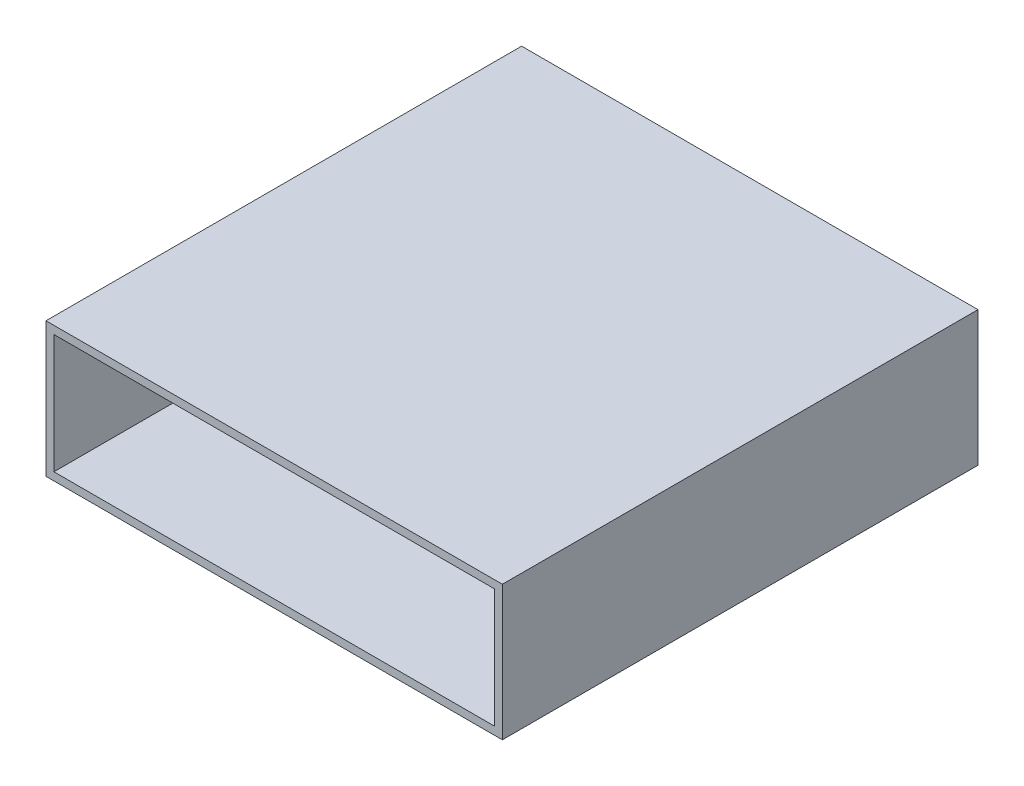
ISO-10303-21;
HEADER;
FILE_DESCRIPTION(('STEP AP214'),'2;1');
FILE_NAME('part.step','',(''),(''),'','','');
FILE_SCHEMA(('AUTOMOTIVE_DESIGN { 1 0 10303 214 1 1 1 1 }'));
ENDSEC;
DATA;
#1=APPLICATION_CONTEXT('core data for automotive mechanical design processes');
#2=APPLICATION_PROTOCOL_DEFINITION('international standard','automotive_design',2000,#1);
#3=PRODUCT_CONTEXT('',#1,'mechanical');
#4=PRODUCT('Part','Part','',(#3));
#5=PRODUCT_RELATED_PRODUCT_CATEGORY('part','',(#4));
#6=PRODUCT_DEFINITION_FORMATION('','',#4);
#7=PRODUCT_DEFINITION_CONTEXT('part definition',#1,'design');
#8=PRODUCT_DEFINITION('design','',#6,#7);
#9=PRODUCT_DEFINITION_SHAPE('','',#8);
#10=(LENGTH_UNIT() NAMED_UNIT(*) SI_UNIT(.MILLI.,.METRE.));
#11=(NAMED_UNIT(*) PLANE_ANGLE_UNIT() SI_UNIT($,.RADIAN.));
#12=(NAMED_UNIT(*) SI_UNIT($,.STERADIAN.) SOLID_ANGLE_UNIT());
#13=UNCERTAINTY_MEASURE_WITH_UNIT(LENGTH_MEASURE(1.E-05),#10,'distance_accuracy_value','');
#14=(GEOMETRIC_REPRESENTATION_CONTEXT(3) GLOBAL_UNCERTAINTY_ASSIGNED_CONTEXT((#13)) GLOBAL_UNIT_ASSIGNED_CONTEXT((#10,
#11,#12)) REPRESENTATION_CONTEXT('',''));
#15=CARTESIAN_POINT('',(0.,0.,0.));
#16=DIRECTION('',(0.,0.,1.));
#17=DIRECTION('',(1.,0.,0.));
#18=AXIS2_PLACEMENT_3D('',#15,#16,#17);
#19=CARTESIAN_POINT('',(0.,0.,120.));
#20=DIRECTION('',(-1.,0.,0.));
#21=DIRECTION('',(0.,-1.,0.));
#22=AXIS2_PLACEMENT_3D('',#19,#20,#21);
#23=PLANE('',#22);
#24=DIRECTION('',(0.,1.,0.));
#25=VECTOR('',#24,1.);
#26=CARTESIAN_POINT('',(0.,0.,0.));
#27=LINE('',#26,#25);
#28=CARTESIAN_POINT('',(0.,0.,0.));
#29=VERTEX_POINT('',#28);
#30=CARTESIAN_POINT('',(0.,34.,0.));
#31=VERTEX_POINT('',#30);
#32=EDGE_CURVE('E184',#29,#31,#27,.T.);
#33=ORIENTED_EDGE('',*,*,#32,.T.);
#34=DIRECTION('',(0.,0.,-1.));
#35=VECTOR('',#34,1.);
#36=CARTESIAN_POINT('',(0.,34.,120.));
#37=LINE('',#36,#35);
#38=CARTESIAN_POINT('',(0.,34.,120.));
#39=VERTEX_POINT('',#38);
#40=EDGE_CURVE('E11',#39,#31,#37,.T.);
#41=ORIENTED_EDGE('',*,*,#40,.F.);
#42=DIRECTION('',(0.,1.,0.));
#43=VECTOR('',#42,1.);
#44=CARTESIAN_POINT('',(0.,0.,120.));
#45=LINE('',#44,#43);
#46=CARTESIAN_POINT('',(0.,0.,120.));
#47=VERTEX_POINT('',#46);
#48=EDGE_CURVE('E190',#47,#39,#45,.T.);
#49=ORIENTED_EDGE('',*,*,#48,.F.);
#50=DIRECTION('',(0.,0.,-1.));
#51=VECTOR('',#50,1.);
#52=CARTESIAN_POINT('',(0.,0.,120.));
#53=LINE('',#52,#51);
#54=EDGE_CURVE('E200',#47,#29,#53,.T.);
#55=ORIENTED_EDGE('',*,*,#54,.T.);
#56=EDGE_LOOP('',(#33,#41,#49,#55));
#57=FACE_BOUND('',#56,.T.);
#58=ADVANCED_FACE('F33',(#57),#23,.F.);
#59=CARTESIAN_POINT('',(0.,34.,120.));
#60=DIRECTION('',(0.,-1.,0.));
#61=DIRECTION('',(1.,0.,0.));
#62=AXIS2_PLACEMENT_3D('',#59,#60,#61);
#63=PLANE('',#62);
#64=DIRECTION('',(-1.,0.,0.));
#65=VECTOR('',#64,1.);
#66=CARTESIAN_POINT('',(0.,34.,0.));
#67=LINE('',#66,#65);
#68=CARTESIAN_POINT('',(-115.14,34.,0.));
#69=VERTEX_POINT('',#68);
#70=EDGE_CURVE('E203',#31,#69,#67,.T.);
#71=ORIENTED_EDGE('',*,*,#70,.T.);
#72=DIRECTION('',(0.,0.,-1.));
#73=VECTOR('',#72,1.);
#74=CARTESIAN_POINT('',(-115.14,34.,120.));
#75=LINE('',#74,#73);
#76=CARTESIAN_POINT('',(-115.14,34.,120.));
#77=VERTEX_POINT('',#76);
#78=EDGE_CURVE('E40',#77,#69,#75,.T.);
#79=ORIENTED_EDGE('',*,*,#78,.F.);
#80=DIRECTION('',(-1.,0.,0.));
#81=VECTOR('',#80,1.);
#82=CARTESIAN_POINT('',(0.,34.,120.));
#83=LINE('',#82,#81);
#84=EDGE_CURVE('E193',#39,#77,#83,.T.);
#85=ORIENTED_EDGE('',*,*,#84,.F.);
#86=ORIENTED_EDGE('',*,*,#40,.T.);
#87=EDGE_LOOP('',(#71,#79,#85,#86));
#88=FACE_BOUND('',#87,.T.);
#89=ADVANCED_FACE('F233',(#88),#63,.F.);
#90=CARTESIAN_POINT('',(-115.14,0.,120.));
#91=DIRECTION('',(1.,0.,0.));
#92=DIRECTION('',(0.,0.,-1.));
#93=AXIS2_PLACEMENT_3D('',#90,#91,#92);
#94=PLANE('',#93);
#95=DIRECTION('',(0.,-1.,0.));
#96=VECTOR('',#95,1.);
#97=CARTESIAN_POINT('',(-115.14,0.,0.));
#98=LINE('',#97,#96);
#99=CARTESIAN_POINT('',(-115.14,0.,0.));
#100=VERTEX_POINT('',#99);
#101=EDGE_CURVE('E205',#69,#100,#98,.T.);
#102=ORIENTED_EDGE('',*,*,#101,.T.);
#103=DIRECTION('',(0.,0.,-1.));
#104=VECTOR('',#103,1.);
#105=CARTESIAN_POINT('',(-115.14,0.,120.));
#106=LINE('',#105,#104);
#107=CARTESIAN_POINT('',(-115.14,0.,120.));
#108=VERTEX_POINT('',#107);
#109=EDGE_CURVE('E210',#108,#100,#106,.T.);
#110=ORIENTED_EDGE('',*,*,#109,.F.);
#111=DIRECTION('',(0.,-1.,0.));
#112=VECTOR('',#111,1.);
#113=CARTESIAN_POINT('',(-115.14,0.,120.));
#114=LINE('',#113,#112);
#115=EDGE_CURVE('E196',#77,#108,#114,.T.);
#116=ORIENTED_EDGE('',*,*,#115,.F.);
#117=ORIENTED_EDGE('',*,*,#78,.T.);
#118=EDGE_LOOP('',(#102,#110,#116,#117));
#119=FACE_BOUND('',#118,.T.);
#120=ADVANCED_FACE('F217',(#119),#94,.F.);
#121=CARTESIAN_POINT('',(0.,0.,120.));
#122=DIRECTION('',(0.,1.,0.));
#123=DIRECTION('',(-1.,0.,0.));
#124=AXIS2_PLACEMENT_3D('',#121,#122,#123);
#125=PLANE('',#124);
#126=DIRECTION('',(1.,0.,0.));
#127=VECTOR('',#126,1.);
#128=CARTESIAN_POINT('',(0.,0.,0.));
#129=LINE('',#128,#127);
#130=EDGE_CURVE('E194',#100,#29,#129,.T.);
#131=ORIENTED_EDGE('',*,*,#130,.T.);
#132=ORIENTED_EDGE('',*,*,#54,.F.);
#133=DIRECTION('',(1.,0.,0.));
#134=VECTOR('',#133,1.);
#135=CARTESIAN_POINT('',(0.,0.,120.));
#136=LINE('',#135,#134);
#137=EDGE_CURVE('E198',#108,#47,#136,.T.);
#138=ORIENTED_EDGE('',*,*,#137,.F.);
#139=ORIENTED_EDGE('',*,*,#109,.T.);
#140=EDGE_LOOP('',(#131,#132,#138,#139));
#141=FACE_BOUND('',#140,.T.);
#142=ADVANCED_FACE('F226',(#141),#125,.F.);
#143=CARTESIAN_POINT('',(0.,0.,120.));
#144=DIRECTION('',(0.,0.,1.));
#145=DIRECTION('',(1.,0.,0.));
#146=AXIS2_PLACEMENT_3D('',#143,#144,#145);
#147=PLANE('',#146);
#148=DIRECTION('',(0.,-1.,0.));
#149=VECTOR('',#148,1.);
#150=CARTESIAN_POINT('',(-113.14,32.,120.));
#151=LINE('',#150,#149);
#152=CARTESIAN_POINT('',(-113.14,32.,120.));
#153=VERTEX_POINT('',#152);
#154=CARTESIAN_POINT('',(-113.14,1.99999999999999,120.));
#155=VERTEX_POINT('',#154);
#156=EDGE_CURVE('E55',#153,#155,#151,.T.);
#157=ORIENTED_EDGE('',*,*,#156,.F.);
#158=DIRECTION('',(-1.,0.,0.));
#159=VECTOR('',#158,1.);
#160=CARTESIAN_POINT('',(-113.14,32.,120.));
#161=LINE('',#160,#159);
#162=CARTESIAN_POINT('',(-2.,32.,120.));
#163=VERTEX_POINT('',#162);
#164=EDGE_CURVE('E163',#163,#153,#161,.T.);
#165=ORIENTED_EDGE('',*,*,#164,.F.);
#166=DIRECTION('',(0.,1.,0.));
#167=VECTOR('',#166,1.);
#168=CARTESIAN_POINT('',(-2.,32.,120.));
#169=LINE('',#168,#167);
#170=CARTESIAN_POINT('',(-2.,1.99999999999999,120.));
#171=VERTEX_POINT('',#170);
#172=EDGE_CURVE('E177',#171,#163,#169,.T.);
#173=ORIENTED_EDGE('',*,*,#172,.F.);
#174=DIRECTION('',(1.,0.,0.));
#175=VECTOR('',#174,1.);
#176=CARTESIAN_POINT('',(-113.14,1.99999999999999,120.));
#177=LINE('',#176,#175);
#178=EDGE_CURVE('E174',#155,#171,#177,.T.);
#179=ORIENTED_EDGE('',*,*,#178,.F.);
#180=EDGE_LOOP('',(#157,#165,#173,#179));
#181=FACE_BOUND('',#180,.T.);
#182=ORIENTED_EDGE('',*,*,#48,.T.);
#183=ORIENTED_EDGE('',*,*,#84,.T.);
#184=ORIENTED_EDGE('',*,*,#115,.T.);
#185=ORIENTED_EDGE('',*,*,#137,.T.);
#186=EDGE_LOOP('',(#182,#183,#184,#185));
#187=FACE_BOUND('',#186,.T.);
#188=ADVANCED_FACE('F232',(#181,#187),#147,.T.);
#189=CARTESIAN_POINT('',(0.,0.,0.));
#190=DIRECTION('',(0.,0.,1.));
#191=DIRECTION('',(1.,0.,0.));
#192=AXIS2_PLACEMENT_3D('',#189,#190,#191);
#193=PLANE('',#192);
#194=DIRECTION('',(-1.,0.,0.));
#195=VECTOR('',#194,1.);
#196=CARTESIAN_POINT('',(-2.,1.99999999999999,0.));
#197=LINE('',#196,#195);
#198=CARTESIAN_POINT('',(-2.,1.99999999999999,0.));
#199=VERTEX_POINT('',#198);
#200=CARTESIAN_POINT('',(-113.14,1.99999999999999,0.));
#201=VERTEX_POINT('',#200);
#202=EDGE_CURVE('E150',#199,#201,#197,.T.);
#203=ORIENTED_EDGE('',*,*,#202,.F.);
#204=DIRECTION('',(0.,-1.,0.));
#205=VECTOR('',#204,1.);
#206=CARTESIAN_POINT('',(-2.,32.,0.));
#207=LINE('',#206,#205);
#208=CARTESIAN_POINT('',(-2.,32.,0.));
#209=VERTEX_POINT('',#208);
#210=EDGE_CURVE('E47',#209,#199,#207,.T.);
#211=ORIENTED_EDGE('',*,*,#210,.F.);
#212=DIRECTION('',(1.,0.,0.));
#213=VECTOR('',#212,1.);
#214=CARTESIAN_POINT('',(-2.,32.,0.));
#215=LINE('',#214,#213);
#216=CARTESIAN_POINT('',(-113.14,32.,0.));
#217=VERTEX_POINT('',#216);
#218=EDGE_CURVE('E141',#217,#209,#215,.T.);
#219=ORIENTED_EDGE('',*,*,#218,.F.);
#220=DIRECTION('',(0.,1.,0.));
#221=VECTOR('',#220,1.);
#222=CARTESIAN_POINT('',(-113.14,32.,0.));
#223=LINE('',#222,#221);
#224=EDGE_CURVE('E144',#201,#217,#223,.T.);
#225=ORIENTED_EDGE('',*,*,#224,.F.);
#226=EDGE_LOOP('',(#203,#211,#219,#225));
#227=FACE_BOUND('',#226,.T.);
#228=ORIENTED_EDGE('',*,*,#32,.F.);
#229=ORIENTED_EDGE('',*,*,#130,.F.);
#230=ORIENTED_EDGE('',*,*,#101,.F.);
#231=ORIENTED_EDGE('',*,*,#70,.F.);
#232=EDGE_LOOP('',(#228,#229,#230,#231));
#233=FACE_BOUND('',#232,.T.);
#234=ADVANCED_FACE('F223',(#227,#233),#193,.F.);
#235=CARTESIAN_POINT('',(-113.14,32.,3.99999999999999));
#236=DIRECTION('',(-1.,0.,0.));
#237=DIRECTION('',(0.,0.,1.));
#238=AXIS2_PLACEMENT_3D('',#235,#236,#237);
#239=PLANE('',#238);
#240=ORIENTED_EDGE('',*,*,#156,.T.);
#241=DIRECTION('',(0.,0.,1.));
#242=VECTOR('',#241,1.);
#243=CARTESIAN_POINT('',(-113.14,1.99999999999999,3.99999999999999));
#244=LINE('',#243,#242);
#245=CARTESIAN_POINT('',(-113.14,1.99999999999999,3.99999999999999));
#246=VERTEX_POINT('',#245);
#247=EDGE_CURVE('E172',#246,#155,#244,.T.);
#248=ORIENTED_EDGE('',*,*,#247,.F.);
#249=DIRECTION('',(0.,-1.,0.));
#250=VECTOR('',#249,1.);
#251=CARTESIAN_POINT('',(-113.14,32.,3.99999999999999));
#252=LINE('',#251,#250);
#253=CARTESIAN_POINT('',(-113.14,32.,3.99999999999999));
#254=VERTEX_POINT('',#253);
#255=EDGE_CURVE('E159',#254,#246,#252,.T.);
#256=ORIENTED_EDGE('',*,*,#255,.F.);
#257=DIRECTION('',(0.,0.,1.));
#258=VECTOR('',#257,1.);
#259=CARTESIAN_POINT('',(-113.14,32.,3.99999999999999));
#260=LINE('',#259,#258);
#261=EDGE_CURVE('E182',#254,#153,#260,.T.);
#262=ORIENTED_EDGE('',*,*,#261,.T.);
#263=EDGE_LOOP('',(#240,#248,#256,#262));
#264=FACE_BOUND('',#263,.T.);
#265=ADVANCED_FACE('F245',(#264),#239,.F.);
#266=CARTESIAN_POINT('',(-113.14,32.,3.99999999999999));
#267=DIRECTION('',(0.,1.,0.));
#268=DIRECTION('',(0.,0.,1.));
#269=AXIS2_PLACEMENT_3D('',#266,#267,#268);
#270=PLANE('',#269);
#271=ORIENTED_EDGE('',*,*,#164,.T.);
#272=ORIENTED_EDGE('',*,*,#261,.F.);
#273=DIRECTION('',(-1.,0.,0.));
#274=VECTOR('',#273,1.);
#275=CARTESIAN_POINT('',(-113.14,32.,3.99999999999999));
#276=LINE('',#275,#274);
#277=CARTESIAN_POINT('',(-2.,32.,3.99999999999999));
#278=VERTEX_POINT('',#277);
#279=EDGE_CURVE('E169',#278,#254,#276,.T.);
#280=ORIENTED_EDGE('',*,*,#279,.F.);
#281=DIRECTION('',(0.,0.,1.));
#282=VECTOR('',#281,1.);
#283=CARTESIAN_POINT('',(-2.,32.,3.99999999999999));
#284=LINE('',#283,#282);
#285=EDGE_CURVE('E185',#278,#163,#284,.T.);
#286=ORIENTED_EDGE('',*,*,#285,.T.);
#287=EDGE_LOOP('',(#271,#272,#280,#286));
#288=FACE_BOUND('',#287,.T.);
#289=ADVANCED_FACE('F252',(#288),#270,.F.);
#290=CARTESIAN_POINT('',(-2.,32.,3.99999999999999));
#291=DIRECTION('',(1.,0.,0.));
#292=DIRECTION('',(0.,0.,-1.));
#293=AXIS2_PLACEMENT_3D('',#290,#291,#292);
#294=PLANE('',#293);
#295=ORIENTED_EDGE('',*,*,#172,.T.);
#296=ORIENTED_EDGE('',*,*,#285,.F.);
#297=DIRECTION('',(0.,1.,0.));
#298=VECTOR('',#297,1.);
#299=CARTESIAN_POINT('',(-2.,32.,3.99999999999999));
#300=LINE('',#299,#298);
#301=CARTESIAN_POINT('',(-2.,1.99999999999999,3.99999999999999));
#302=VERTEX_POINT('',#301);
#303=EDGE_CURVE('E166',#302,#278,#300,.T.);
#304=ORIENTED_EDGE('',*,*,#303,.F.);
#305=DIRECTION('',(0.,0.,1.));
#306=VECTOR('',#305,1.);
#307=CARTESIAN_POINT('',(-2.,1.99999999999999,3.99999999999999));
#308=LINE('',#307,#306);
#309=EDGE_CURVE('E187',#302,#171,#308,.T.);
#310=ORIENTED_EDGE('',*,*,#309,.T.);
#311=EDGE_LOOP('',(#295,#296,#304,#310));
#312=FACE_BOUND('',#311,.T.);
#313=ADVANCED_FACE('F257',(#312),#294,.F.);
#314=CARTESIAN_POINT('',(-113.14,1.99999999999999,3.99999999999999));
#315=DIRECTION('',(0.,-1.,0.));
#316=DIRECTION('',(0.,0.,-1.));
#317=AXIS2_PLACEMENT_3D('',#314,#315,#316);
#318=PLANE('',#317);
#319=ORIENTED_EDGE('',*,*,#178,.T.);
#320=ORIENTED_EDGE('',*,*,#309,.F.);
#321=DIRECTION('',(1.,0.,0.));
#322=VECTOR('',#321,1.);
#323=CARTESIAN_POINT('',(-113.14,1.99999999999999,3.99999999999999));
#324=LINE('',#323,#322);
#325=EDGE_CURVE('E162',#246,#302,#324,.T.);
#326=ORIENTED_EDGE('',*,*,#325,.F.);
#327=ORIENTED_EDGE('',*,*,#247,.T.);
#328=EDGE_LOOP('',(#319,#320,#326,#327));
#329=FACE_BOUND('',#328,.T.);
#330=ADVANCED_FACE('F253',(#329),#318,.F.);
#331=CARTESIAN_POINT('',(0.,0.,3.99999999999999));
#332=DIRECTION('',(0.,0.,1.));
#333=DIRECTION('',(1.,0.,0.));
#334=AXIS2_PLACEMENT_3D('',#331,#332,#333);
#335=PLANE('',#334);
#336=ORIENTED_EDGE('',*,*,#255,.T.);
#337=ORIENTED_EDGE('',*,*,#325,.T.);
#338=ORIENTED_EDGE('',*,*,#303,.T.);
#339=ORIENTED_EDGE('',*,*,#279,.T.);
#340=EDGE_LOOP('',(#336,#337,#338,#339));
#341=FACE_BOUND('',#340,.T.);
#342=ADVANCED_FACE('F256',(#341),#335,.T.);
#343=CARTESIAN_POINT('',(-2.,32.,2.));
#344=DIRECTION('',(1.,0.,0.));
#345=DIRECTION('',(0.,1.,0.));
#346=AXIS2_PLACEMENT_3D('',#343,#344,#345);
#347=PLANE('',#346);
#348=ORIENTED_EDGE('',*,*,#210,.T.);
#349=DIRECTION('',(0.,0.,-1.));
#350=VECTOR('',#349,1.);
#351=CARTESIAN_POINT('',(-2.,1.99999999999999,2.));
#352=LINE('',#351,#350);
#353=CARTESIAN_POINT('',(-2.,1.99999999999999,2.));
#354=VERTEX_POINT('',#353);
#355=EDGE_CURVE('E119',#354,#199,#352,.T.);
#356=ORIENTED_EDGE('',*,*,#355,.F.);
#357=DIRECTION('',(0.,-1.,0.));
#358=VECTOR('',#357,1.);
#359=CARTESIAN_POINT('',(-2.,32.,2.));
#360=LINE('',#359,#358);
#361=CARTESIAN_POINT('',(-2.,32.,2.));
#362=VERTEX_POINT('',#361);
#363=EDGE_CURVE('E123',#362,#354,#360,.T.);
#364=ORIENTED_EDGE('',*,*,#363,.F.);
#365=DIRECTION('',(0.,0.,-1.));
#366=VECTOR('',#365,1.);
#367=CARTESIAN_POINT('',(-2.,32.,2.));
#368=LINE('',#367,#366);
#369=EDGE_CURVE('E154',#362,#209,#368,.T.);
#370=ORIENTED_EDGE('',*,*,#369,.T.);
#371=EDGE_LOOP('',(#348,#356,#364,#370));
#372=FACE_BOUND('',#371,.T.);
#373=ADVANCED_FACE('F121',(#372),#347,.F.);
#374=CARTESIAN_POINT('',(-2.,32.,2.));
#375=DIRECTION('',(0.,1.,0.));
#376=DIRECTION('',(0.,0.,1.));
#377=AXIS2_PLACEMENT_3D('',#374,#375,#376);
#378=PLANE('',#377);
#379=ORIENTED_EDGE('',*,*,#218,.T.);
#380=ORIENTED_EDGE('',*,*,#369,.F.);
#381=DIRECTION('',(1.,0.,0.));
#382=VECTOR('',#381,1.);
#383=CARTESIAN_POINT('',(-2.,32.,2.));
#384=LINE('',#383,#382);
#385=CARTESIAN_POINT('',(-113.14,32.,2.));
#386=VERTEX_POINT('',#385);
#387=EDGE_CURVE('E129',#386,#362,#384,.T.);
#388=ORIENTED_EDGE('',*,*,#387,.F.);
#389=DIRECTION('',(0.,0.,-1.));
#390=VECTOR('',#389,1.);
#391=CARTESIAN_POINT('',(-113.14,32.,2.));
#392=LINE('',#391,#390);
#393=EDGE_CURVE('E156',#386,#217,#392,.T.);
#394=ORIENTED_EDGE('',*,*,#393,.T.);
#395=EDGE_LOOP('',(#379,#380,#388,#394));
#396=FACE_BOUND('',#395,.T.);
#397=ADVANCED_FACE('F270',(#396),#378,.F.);
#398=CARTESIAN_POINT('',(-113.14,32.,2.));
#399=DIRECTION('',(-1.,0.,0.));
#400=DIRECTION('',(0.,0.,1.));
#401=AXIS2_PLACEMENT_3D('',#398,#399,#400);
#402=PLANE('',#401);
#403=ORIENTED_EDGE('',*,*,#224,.T.);
#404=ORIENTED_EDGE('',*,*,#393,.F.);
#405=DIRECTION('',(0.,1.,0.));
#406=VECTOR('',#405,1.);
#407=CARTESIAN_POINT('',(-113.14,32.,2.));
#408=LINE('',#407,#406);
#409=CARTESIAN_POINT('',(-113.14,1.99999999999999,2.));
#410=VERTEX_POINT('',#409);
#411=EDGE_CURVE('E137',#410,#386,#408,.T.);
#412=ORIENTED_EDGE('',*,*,#411,.F.);
#413=DIRECTION('',(0.,0.,-1.));
#414=VECTOR('',#413,1.);
#415=CARTESIAN_POINT('',(-113.14,1.99999999999999,2.));
#416=LINE('',#415,#414);
#417=EDGE_CURVE('E128',#410,#201,#416,.T.);
#418=ORIENTED_EDGE('',*,*,#417,.T.);
#419=EDGE_LOOP('',(#403,#404,#412,#418));
#420=FACE_BOUND('',#419,.T.);
#421=ADVANCED_FACE('F273',(#420),#402,.F.);
#422=CARTESIAN_POINT('',(-2.,1.99999999999999,2.));
#423=DIRECTION('',(0.,-1.,0.));
#424=DIRECTION('',(0.,0.,-1.));
#425=AXIS2_PLACEMENT_3D('',#422,#423,#424);
#426=PLANE('',#425);
#427=ORIENTED_EDGE('',*,*,#202,.T.);
#428=ORIENTED_EDGE('',*,*,#417,.F.);
#429=DIRECTION('',(-1.,0.,0.));
#430=VECTOR('',#429,1.);
#431=CARTESIAN_POINT('',(-2.,1.99999999999999,2.));
#432=LINE('',#431,#430);
#433=EDGE_CURVE('E132',#354,#410,#432,.T.);
#434=ORIENTED_EDGE('',*,*,#433,.F.);
#435=ORIENTED_EDGE('',*,*,#355,.T.);
#436=EDGE_LOOP('',(#427,#428,#434,#435));
#437=FACE_BOUND('',#436,.T.);
#438=ADVANCED_FACE('F133',(#437),#426,.F.);
#439=CARTESIAN_POINT('',(0.,0.,2.));
#440=DIRECTION('',(0.,0.,-1.));
#441=DIRECTION('',(-1.,0.,0.));
#442=AXIS2_PLACEMENT_3D('',#439,#440,#441);
#443=PLANE('',#442);
#444=ORIENTED_EDGE('',*,*,#363,.T.);
#445=ORIENTED_EDGE('',*,*,#433,.T.);
#446=ORIENTED_EDGE('',*,*,#411,.T.);
#447=ORIENTED_EDGE('',*,*,#387,.T.);
#448=EDGE_LOOP('',(#444,#445,#446,#447));
#449=FACE_BOUND('',#448,.T.);
#450=ADVANCED_FACE('F139',(#449),#443,.T.);
#451=CLOSED_SHELL('',(#58,#89,#120,#142,#188,#234,#265,#289,#313,#330,#342,#373,#397,#421,#438,#450));
#452=MANIFOLD_SOLID_BREP('B2',#451);
#453=ADVANCED_BREP_SHAPE_REPRESENTATION('',(#18,#452),#14);
#454=SHAPE_DEFINITION_REPRESENTATION(#9,#453);
ENDSEC;
END-ISO-10303-21;
